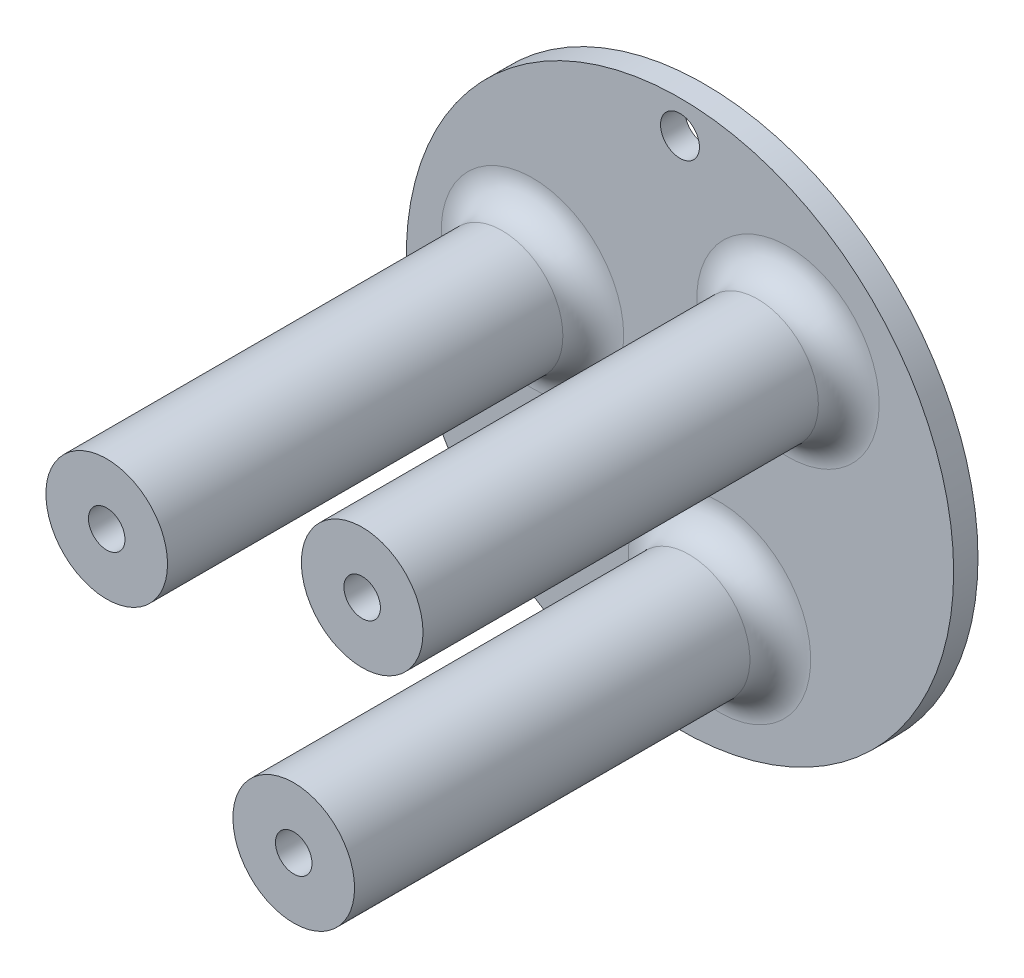
ISO-10303-21;
HEADER;
FILE_DESCRIPTION(('STEP AP214'),'2;1');
FILE_NAME('part.step','',(''),(''),'','','');
FILE_SCHEMA(('AUTOMOTIVE_DESIGN { 1 0 10303 214 1 1 1 1 }'));
ENDSEC;
DATA;
#1=APPLICATION_CONTEXT('core data for automotive mechanical design processes');
#2=APPLICATION_PROTOCOL_DEFINITION('international standard','automotive_design',2000,#1);
#3=PRODUCT_CONTEXT('',#1,'mechanical');
#4=PRODUCT('Part','Part','',(#3));
#5=PRODUCT_RELATED_PRODUCT_CATEGORY('part','',(#4));
#6=PRODUCT_DEFINITION_FORMATION('','',#4);
#7=PRODUCT_DEFINITION_CONTEXT('part definition',#1,'design');
#8=PRODUCT_DEFINITION('design','',#6,#7);
#9=PRODUCT_DEFINITION_SHAPE('','',#8);
#10=(LENGTH_UNIT() NAMED_UNIT(*) SI_UNIT(.MILLI.,.METRE.));
#11=(NAMED_UNIT(*) PLANE_ANGLE_UNIT() SI_UNIT($,.RADIAN.));
#12=(NAMED_UNIT(*) SI_UNIT($,.STERADIAN.) SOLID_ANGLE_UNIT());
#13=UNCERTAINTY_MEASURE_WITH_UNIT(LENGTH_MEASURE(1.E-05),#10,'distance_accuracy_value','');
#14=(GEOMETRIC_REPRESENTATION_CONTEXT(3) GLOBAL_UNCERTAINTY_ASSIGNED_CONTEXT((#13)) GLOBAL_UNIT_ASSIGNED_CONTEXT((#10,
#11,#12)) REPRESENTATION_CONTEXT('',''));
#15=CARTESIAN_POINT('',(0.,0.,0.));
#16=DIRECTION('',(0.,0.,1.));
#17=DIRECTION('',(1.,0.,0.));
#18=AXIS2_PLACEMENT_3D('',#15,#16,#17);
#19=CARTESIAN_POINT('',(0.,0.,2.));
#20=DIRECTION('',(0.,0.,1.));
#21=DIRECTION('',(1.,0.,0.));
#22=AXIS2_PLACEMENT_3D('',#19,#20,#21);
#23=PLANE('',#22);
#24=CARTESIAN_POINT('',(8.87639550230623,8.87639550230733,2.));
#25=DIRECTION('',(0.,0.,1.));
#26=DIRECTION('',(1.,0.,0.));
#27=AXIS2_PLACEMENT_3D('',#24,#25,#26);
#28=CIRCLE('',#27,7.5);
#29=CARTESIAN_POINT('',(16.3763955023062,8.87639550230733,2.));
#30=VERTEX_POINT('',#29);
#31=EDGE_CURVE('E87',#30,#30,#28,.F.);
#32=ORIENTED_EDGE('',*,*,#31,.T.);
#33=EDGE_LOOP('',(#32));
#34=FACE_BOUND('',#33,.T.);
#35=CARTESIAN_POINT('',(-12.1253817501885,3.24898624788211,2.));
#36=DIRECTION('',(0.,0.,1.));
#37=DIRECTION('',(1.,0.,0.));
#38=AXIS2_PLACEMENT_3D('',#35,#36,#37);
#39=CIRCLE('',#38,7.5);
#40=CARTESIAN_POINT('',(-4.62538175018853,3.24898624788211,2.));
#41=VERTEX_POINT('',#40);
#42=EDGE_CURVE('E88',#41,#41,#39,.F.);
#43=ORIENTED_EDGE('',*,*,#42,.T.);
#44=EDGE_LOOP('',(#43));
#45=FACE_BOUND('',#44,.T.);
#46=CARTESIAN_POINT('',(0.,19.8,2.));
#47=DIRECTION('',(0.,0.,1.));
#48=DIRECTION('',(1.,0.,0.));
#49=AXIS2_PLACEMENT_3D('',#46,#47,#48);
#50=CIRCLE('',#49,1.6);
#51=CARTESIAN_POINT('',(1.6,19.8,2.));
#52=VERTEX_POINT('',#51);
#53=EDGE_CURVE('E146',#52,#52,#50,.T.);
#54=ORIENTED_EDGE('',*,*,#53,.F.);
#55=EDGE_LOOP('',(#54));
#56=FACE_BOUND('',#55,.T.);
#57=CARTESIAN_POINT('',(0.,0.,2.));
#58=DIRECTION('',(0.,0.,1.));
#59=DIRECTION('',(1.,0.,0.));
#60=AXIS2_PLACEMENT_3D('',#57,#58,#59);
#61=CIRCLE('',#60,22.5);
#62=CARTESIAN_POINT('',(22.5,0.,2.));
#63=VERTEX_POINT('',#62);
#64=EDGE_CURVE('E149',#63,#63,#61,.T.);
#65=ORIENTED_EDGE('',*,*,#64,.T.);
#66=EDGE_LOOP('',(#65));
#67=FACE_BOUND('',#66,.T.);
#68=CARTESIAN_POINT('',(0.,-19.8,2.));
#69=DIRECTION('',(0.,0.,1.));
#70=DIRECTION('',(1.,0.,0.));
#71=AXIS2_PLACEMENT_3D('',#68,#69,#70);
#72=CIRCLE('',#71,1.6);
#73=CARTESIAN_POINT('',(-0.819635602999164,-18.4258830187003,2.));
#74=VERTEX_POINT('',#73);
#75=CARTESIAN_POINT('',(1.5571198486546,-19.4320628084498,2.));
#76=VERTEX_POINT('',#75);
#77=EDGE_CURVE('E84',#74,#76,#72,.T.);
#78=ORIENTED_EDGE('',*,*,#77,.F.);
#79=CARTESIAN_POINT('',(3.24898624788274,-12.1253817501879,2.));
#80=DIRECTION('',(0.,0.,1.));
#81=DIRECTION('',(1.,0.,0.));
#82=AXIS2_PLACEMENT_3D('',#79,#80,#81);
#83=CIRCLE('',#82,7.5);
#84=EDGE_CURVE('E82',#74,#76,#83,.F.);
#85=ORIENTED_EDGE('',*,*,#84,.T.);
#86=EDGE_LOOP('',(#78,#85));
#87=FACE_BOUND('',#86,.T.);
#88=ADVANCED_FACE('F40',(#34,#45,#56,#67,#87),#23,.T.);
#89=CARTESIAN_POINT('',(0.,0.,0.));
#90=DIRECTION('',(0.,0.,1.));
#91=DIRECTION('',(1.,0.,0.));
#92=AXIS2_PLACEMENT_3D('',#89,#90,#91);
#93=PLANE('',#92);
#94=CARTESIAN_POINT('',(0.,0.,0.));
#95=DIRECTION('',(0.,0.,1.));
#96=DIRECTION('',(1.,0.,0.));
#97=AXIS2_PLACEMENT_3D('',#94,#95,#96);
#98=CIRCLE('',#97,22.5);
#99=CARTESIAN_POINT('',(22.5,0.,0.));
#100=VERTEX_POINT('',#99);
#101=EDGE_CURVE('E151',#100,#100,#98,.T.);
#102=ORIENTED_EDGE('',*,*,#101,.F.);
#103=EDGE_LOOP('',(#102));
#104=FACE_BOUND('',#103,.T.);
#105=CARTESIAN_POINT('',(0.,19.8,0.));
#106=DIRECTION('',(0.,0.,1.));
#107=DIRECTION('',(1.,0.,0.));
#108=AXIS2_PLACEMENT_3D('',#105,#106,#107);
#109=CIRCLE('',#108,1.6);
#110=CARTESIAN_POINT('',(1.6,19.8,0.));
#111=VERTEX_POINT('',#110);
#112=EDGE_CURVE('E97',#111,#111,#109,.T.);
#113=ORIENTED_EDGE('',*,*,#112,.T.);
#114=EDGE_LOOP('',(#113));
#115=FACE_BOUND('',#114,.T.);
#116=CARTESIAN_POINT('',(0.,-19.8,0.));
#117=DIRECTION('',(0.,0.,1.));
#118=DIRECTION('',(1.,0.,0.));
#119=AXIS2_PLACEMENT_3D('',#116,#117,#118);
#120=CIRCLE('',#119,1.6);
#121=CARTESIAN_POINT('',(1.6,-19.8,0.));
#122=VERTEX_POINT('',#121);
#123=EDGE_CURVE('E94',#122,#122,#120,.T.);
#124=ORIENTED_EDGE('',*,*,#123,.T.);
#125=EDGE_LOOP('',(#124));
#126=FACE_BOUND('',#125,.T.);
#127=ADVANCED_FACE('F127',(#104,#115,#126),#93,.F.);
#128=CARTESIAN_POINT('',(0.,0.,2.));
#129=DIRECTION('',(0.,0.,-1.));
#130=DIRECTION('',(-1.,0.,0.));
#131=AXIS2_PLACEMENT_3D('',#128,#129,#130);
#132=CYLINDRICAL_SURFACE('',#131,22.5);
#133=ORIENTED_EDGE('',*,*,#64,.F.);
#134=EDGE_LOOP('',(#133));
#135=FACE_BOUND('',#134,.T.);
#136=ORIENTED_EDGE('',*,*,#101,.T.);
#137=EDGE_LOOP('',(#136));
#138=FACE_BOUND('',#137,.T.);
#139=ADVANCED_FACE('F122',(#135,#138),#132,.T.);
#140=CARTESIAN_POINT('',(0.,19.8,2.));
#141=DIRECTION('',(0.,0.,-1.));
#142=DIRECTION('',(-1.,0.,0.));
#143=AXIS2_PLACEMENT_3D('',#140,#141,#142);
#144=CYLINDRICAL_SURFACE('',#143,1.6);
#145=ORIENTED_EDGE('',*,*,#53,.T.);
#146=EDGE_LOOP('',(#145));
#147=FACE_BOUND('',#146,.T.);
#148=ORIENTED_EDGE('',*,*,#112,.F.);
#149=EDGE_LOOP('',(#148));
#150=FACE_BOUND('',#149,.T.);
#151=ADVANCED_FACE('F118',(#147,#150),#144,.F.);
#152=CARTESIAN_POINT('',(0.,-19.8,2.));
#153=DIRECTION('',(0.,0.,-1.));
#154=DIRECTION('',(-1.,0.,0.));
#155=AXIS2_PLACEMENT_3D('',#152,#153,#154);
#156=CYLINDRICAL_SURFACE('',#155,1.6);
#157=EDGE_CURVE('E93',#76,#74,#72,.T.);
#158=ORIENTED_EDGE('',*,*,#157,.T.);
#159=ORIENTED_EDGE('',*,*,#77,.T.);
#160=EDGE_LOOP('',(#158,#159));
#161=FACE_BOUND('',#160,.T.);
#162=ORIENTED_EDGE('',*,*,#123,.F.);
#163=EDGE_LOOP('',(#162));
#164=FACE_BOUND('',#163,.T.);
#165=ADVANCED_FACE('F91',(#161,#164),#156,.F.);
#166=CARTESIAN_POINT('',(-12.1253817501885,3.24898624788211,37.));
#167=DIRECTION('',(0.,0.,1.));
#168=DIRECTION('',(1.,0.,0.));
#169=AXIS2_PLACEMENT_3D('',#166,#167,#168);
#170=PLANE('',#169);
#171=CARTESIAN_POINT('',(-12.1253817501885,3.24898624788211,37.));
#172=DIRECTION('',(0.,0.,1.));
#173=DIRECTION('',(1.,0.,0.));
#174=AXIS2_PLACEMENT_3D('',#171,#172,#173);
#175=CIRCLE('',#174,5.);
#176=CARTESIAN_POINT('',(-7.12538175018853,3.24898624788211,37.));
#177=VERTEX_POINT('',#176);
#178=EDGE_CURVE('E216',#177,#177,#175,.T.);
#179=ORIENTED_EDGE('',*,*,#178,.T.);
#180=EDGE_LOOP('',(#179));
#181=FACE_BOUND('',#180,.T.);
#182=CARTESIAN_POINT('',(-12.1253817501885,3.24898624788211,37.));
#183=DIRECTION('',(0.,0.,1.));
#184=DIRECTION('',(1.,0.,0.));
#185=AXIS2_PLACEMENT_3D('',#182,#183,#184);
#186=CIRCLE('',#185,1.5);
#187=CARTESIAN_POINT('',(-10.6253817501885,3.24898624788211,37.));
#188=VERTEX_POINT('',#187);
#189=EDGE_CURVE('E219',#188,#188,#186,.T.);
#190=ORIENTED_EDGE('',*,*,#189,.F.);
#191=EDGE_LOOP('',(#190));
#192=FACE_BOUND('',#191,.T.);
#193=ADVANCED_FACE('F117',(#181,#192),#170,.T.);
#194=CARTESIAN_POINT('',(-12.1253817501885,3.24898624788211,37.));
#195=DIRECTION('',(0.,0.,-1.));
#196=DIRECTION('',(-1.,0.,0.));
#197=AXIS2_PLACEMENT_3D('',#194,#195,#196);
#198=CYLINDRICAL_SURFACE('',#197,5.);
#199=CARTESIAN_POINT('',(-12.1253817501885,3.24898624788211,4.5));
#200=DIRECTION('',(0.,0.,1.));
#201=DIRECTION('',(1.,0.,0.));
#202=AXIS2_PLACEMENT_3D('',#199,#200,#201);
#203=CIRCLE('',#202,5.);
#204=CARTESIAN_POINT('',(-7.12538175018853,3.24898624788211,4.5));
#205=VERTEX_POINT('',#204);
#206=EDGE_CURVE('E11',#205,#205,#203,.T.);
#207=ORIENTED_EDGE('',*,*,#206,.T.);
#208=EDGE_LOOP('',(#207));
#209=FACE_BOUND('',#208,.T.);
#210=ORIENTED_EDGE('',*,*,#178,.F.);
#211=EDGE_LOOP('',(#210));
#212=FACE_BOUND('',#211,.T.);
#213=ADVANCED_FACE('F119',(#209,#212),#198,.T.);
#214=CARTESIAN_POINT('',(-12.1253817501885,3.24898624788211,37.));
#215=DIRECTION('',(0.,0.,-1.));
#216=DIRECTION('',(-1.,0.,0.));
#217=AXIS2_PLACEMENT_3D('',#214,#215,#216);
#218=CYLINDRICAL_SURFACE('',#217,1.5);
#219=CARTESIAN_POINT('',(-12.1253817501885,3.24898624788211,17.));
#220=DIRECTION('',(0.,0.,1.));
#221=DIRECTION('',(1.,0.,0.));
#222=AXIS2_PLACEMENT_3D('',#219,#220,#221);
#223=CIRCLE('',#222,1.5);
#224=CARTESIAN_POINT('',(-10.6253817501885,3.24898624788211,17.));
#225=VERTEX_POINT('',#224);
#226=EDGE_CURVE('E150',#225,#225,#223,.T.);
#227=ORIENTED_EDGE('',*,*,#226,.F.);
#228=EDGE_LOOP('',(#227));
#229=FACE_BOUND('',#228,.T.);
#230=ORIENTED_EDGE('',*,*,#189,.T.);
#231=EDGE_LOOP('',(#230));
#232=FACE_BOUND('',#231,.T.);
#233=ADVANCED_FACE('F200',(#229,#232),#218,.F.);
#234=CARTESIAN_POINT('',(8.87639550230623,8.87639550230733,37.));
#235=DIRECTION('',(0.,0.,1.));
#236=DIRECTION('',(1.,0.,0.));
#237=AXIS2_PLACEMENT_3D('',#234,#235,#236);
#238=PLANE('',#237);
#239=CARTESIAN_POINT('',(8.87639550230623,8.87639550230733,37.));
#240=DIRECTION('',(0.,0.,1.));
#241=DIRECTION('',(1.,0.,0.));
#242=AXIS2_PLACEMENT_3D('',#239,#240,#241);
#243=CIRCLE('',#242,5.);
#244=CARTESIAN_POINT('',(13.8763955023062,8.87639550230733,37.));
#245=VERTEX_POINT('',#244);
#246=EDGE_CURVE('E225',#245,#245,#243,.T.);
#247=ORIENTED_EDGE('',*,*,#246,.T.);
#248=EDGE_LOOP('',(#247));
#249=FACE_BOUND('',#248,.T.);
#250=CARTESIAN_POINT('',(8.87639550230646,8.87639550230643,37.));
#251=DIRECTION('',(0.,0.,1.));
#252=DIRECTION('',(1.,0.,0.));
#253=AXIS2_PLACEMENT_3D('',#250,#251,#252);
#254=CIRCLE('',#253,1.5);
#255=CARTESIAN_POINT('',(10.3763955023065,8.87639550230643,37.));
#256=VERTEX_POINT('',#255);
#257=EDGE_CURVE('E221',#256,#256,#254,.T.);
#258=ORIENTED_EDGE('',*,*,#257,.F.);
#259=EDGE_LOOP('',(#258));
#260=FACE_BOUND('',#259,.T.);
#261=ADVANCED_FACE('F196',(#249,#260),#238,.T.);
#262=CARTESIAN_POINT('',(8.87639550230623,8.87639550230733,37.));
#263=DIRECTION('',(0.,0.,-1.));
#264=DIRECTION('',(-1.,0.,0.));
#265=AXIS2_PLACEMENT_3D('',#262,#263,#264);
#266=CYLINDRICAL_SURFACE('',#265,5.);
#267=CARTESIAN_POINT('',(8.87639550230623,8.87639550230733,4.5));
#268=DIRECTION('',(0.,0.,1.));
#269=DIRECTION('',(1.,0.,0.));
#270=AXIS2_PLACEMENT_3D('',#267,#268,#269);
#271=CIRCLE('',#270,5.);
#272=CARTESIAN_POINT('',(13.8763955023062,8.87639550230733,4.5));
#273=VERTEX_POINT('',#272);
#274=EDGE_CURVE('E166',#273,#273,#271,.T.);
#275=ORIENTED_EDGE('',*,*,#274,.T.);
#276=EDGE_LOOP('',(#275));
#277=FACE_BOUND('',#276,.T.);
#278=ORIENTED_EDGE('',*,*,#246,.F.);
#279=EDGE_LOOP('',(#278));
#280=FACE_BOUND('',#279,.T.);
#281=ADVANCED_FACE('F193',(#277,#280),#266,.T.);
#282=CARTESIAN_POINT('',(8.87639550230646,8.87639550230643,37.));
#283=DIRECTION('',(0.,0.,-1.));
#284=DIRECTION('',(-1.,0.,0.));
#285=AXIS2_PLACEMENT_3D('',#282,#283,#284);
#286=CYLINDRICAL_SURFACE('',#285,1.5);
#287=CARTESIAN_POINT('',(8.87639550230646,8.87639550230643,17.));
#288=DIRECTION('',(0.,0.,1.));
#289=DIRECTION('',(1.,0.,0.));
#290=AXIS2_PLACEMENT_3D('',#287,#288,#289);
#291=CIRCLE('',#290,1.5);
#292=CARTESIAN_POINT('',(10.3763955023065,8.87639550230643,17.));
#293=VERTEX_POINT('',#292);
#294=EDGE_CURVE('E154',#293,#293,#291,.T.);
#295=ORIENTED_EDGE('',*,*,#294,.F.);
#296=EDGE_LOOP('',(#295));
#297=FACE_BOUND('',#296,.T.);
#298=ORIENTED_EDGE('',*,*,#257,.T.);
#299=EDGE_LOOP('',(#298));
#300=FACE_BOUND('',#299,.T.);
#301=ADVANCED_FACE('F188',(#297,#300),#286,.F.);
#302=CARTESIAN_POINT('',(3.24898624788274,-12.1253817501879,37.));
#303=DIRECTION('',(0.,0.,1.));
#304=DIRECTION('',(1.,0.,0.));
#305=AXIS2_PLACEMENT_3D('',#302,#303,#304);
#306=PLANE('',#305);
#307=CARTESIAN_POINT('',(3.24898624788274,-12.1253817501879,37.));
#308=DIRECTION('',(0.,0.,1.));
#309=DIRECTION('',(1.,0.,0.));
#310=AXIS2_PLACEMENT_3D('',#307,#308,#309);
#311=CIRCLE('',#310,5.);
#312=CARTESIAN_POINT('',(8.24898624788274,-12.1253817501879,37.));
#313=VERTEX_POINT('',#312);
#314=EDGE_CURVE('E100',#313,#313,#311,.T.);
#315=ORIENTED_EDGE('',*,*,#314,.T.);
#316=EDGE_LOOP('',(#315));
#317=FACE_BOUND('',#316,.T.);
#318=CARTESIAN_POINT('',(3.24898624788208,-12.1253817501885,37.));
#319=DIRECTION('',(0.,0.,1.));
#320=DIRECTION('',(1.,0.,0.));
#321=AXIS2_PLACEMENT_3D('',#318,#319,#320);
#322=CIRCLE('',#321,1.5);
#323=CARTESIAN_POINT('',(4.74898624788208,-12.1253817501885,37.));
#324=VERTEX_POINT('',#323);
#325=EDGE_CURVE('E237',#324,#324,#322,.T.);
#326=ORIENTED_EDGE('',*,*,#325,.F.);
#327=EDGE_LOOP('',(#326));
#328=FACE_BOUND('',#327,.T.);
#329=ADVANCED_FACE('F182',(#317,#328),#306,.T.);
#330=CARTESIAN_POINT('',(3.24898624788274,-12.1253817501879,37.));
#331=DIRECTION('',(0.,0.,-1.));
#332=DIRECTION('',(-1.,0.,0.));
#333=AXIS2_PLACEMENT_3D('',#330,#331,#332);
#334=CYLINDRICAL_SURFACE('',#333,5.);
#335=CARTESIAN_POINT('',(3.24898624788274,-12.1253817501879,4.5));
#336=DIRECTION('',(0.,0.,1.));
#337=DIRECTION('',(1.,0.,0.));
#338=AXIS2_PLACEMENT_3D('',#335,#336,#337);
#339=CIRCLE('',#338,5.);
#340=CARTESIAN_POINT('',(2.12107531506398,-16.9965024556958,4.5));
#341=VERTEX_POINT('',#340);
#342=CARTESIAN_POINT('',(0.536571680628133,-16.3257159291962,4.5));
#343=VERTEX_POINT('',#342);
#344=EDGE_CURVE('E65',#341,#343,#339,.T.);
#345=ORIENTED_EDGE('',*,*,#344,.T.);
#346=CARTESIAN_POINT('',(0.294410797133569,-16.1590505399909,4.46628111594363));
#347=CARTESIAN_POINT('',(0.625372035199988,-16.4014725136573,1.87075022355507));
#348=CARTESIAN_POINT('',(-0.941961150610801,-18.5066674090784,2.));
#349=CARTESIAN_POINT('',(0.315356500499125,-16.1743935572757,4.4724398897492));
#350=CARTESIAN_POINT('',(0.615458480193219,-16.3915657183082,1.87801889354864));
#351=CARTESIAN_POINT('',(-0.934323558492292,-18.5011142264454,2.));
#352=CARTESIAN_POINT('',(0.336495436539265,-16.1896259683654,4.47772145775334));
#353=CARTESIAN_POINT('',(0.605726581884699,-16.3823137458833,1.88641094843269));
#354=CARTESIAN_POINT('',(-0.92602281297485,-18.4951631488922,2.));
#355=CARTESIAN_POINT('',(0.379146027682397,-16.2198535975708,4.48658841081184));
#356=CARTESIAN_POINT('',(0.587181824639358,-16.3654265100251,1.90549747707554));
#357=CARTESIAN_POINT('',(-0.907761191183319,-18.4823883300672,2.));
#358=CARTESIAN_POINT('',(0.400658183758189,-16.234848435227,4.49017129792471));
#359=CARTESIAN_POINT('',(0.578374886279501,-16.3577948517131,1.91617841656128));
#360=CARTESIAN_POINT('',(-0.89779789901017,-18.4755633222672,2.));
#361=CARTESIAN_POINT('',(0.443912394536721,-16.2644935344249,4.49567278809467));
#362=CARTESIAN_POINT('',(0.562263204112896,-16.3444708537823,1.93981522071669));
#363=CARTESIAN_POINT('',(-0.875931939887049,-18.4610023414975,2.));
#364=CARTESIAN_POINT('',(0.465653525629068,-16.2791447229522,4.49759653493978));
#365=CARTESIAN_POINT('',(0.55495469131483,-16.3387700345339,1.95274215693768));
#366=CARTESIAN_POINT('',(-0.864035403828488,-18.4532692691043,2.));
#367=CARTESIAN_POINT('',(0.509361273294691,-16.3081011458751,4.49987554623895));
#368=CARTESIAN_POINT('',(0.542442560516338,-16.3295573310685,1.98080942381337));
#369=CARTESIAN_POINT('',(-0.837878518119624,-18.4368434624638,2.));
#370=CARTESIAN_POINT('',(0.531327584563999,-16.3224067781335,4.50023270931222));
#371=CARTESIAN_POINT('',(0.537231016398835,-16.3260353195471,1.99592096783945));
#372=CARTESIAN_POINT('',(-0.823621051566726,-18.4281519029643,2.));
#373=CARTESIAN_POINT('',(0.591718770269872,-16.3610632725792,4.49920260803043));
#374=CARTESIAN_POINT('',(0.526768246612817,-16.319746622721,2.04002803882277));
#375=CARTESIAN_POINT('',(-0.780695491202649,-18.4030280295183,2.));
#376=CARTESIAN_POINT('',(0.630361474474926,-16.3850604719764,4.49633845619348));
#377=CARTESIAN_POINT('',(0.524206845266073,-16.3193596791769,2.07111638571168));
#378=CARTESIAN_POINT('',(-0.749142984209174,-18.3856056242948,2.));
#379=CARTESIAN_POINT('',(0.708136775240847,-16.4319055420797,4.48691501913684));
#380=CARTESIAN_POINT('',(0.531389583153325,-16.3271880938516,2.13833753756292));
#381=CARTESIAN_POINT('',(-0.673930110321679,-18.348236148108,2.));
#382=CARTESIAN_POINT('',(0.747269490298202,-16.4547531278059,4.48035482256581));
#383=CARTESIAN_POINT('',(0.540953730444524,-16.3352732571851,2.17429650273422));
#384=CARTESIAN_POINT('',(-0.630266758547662,-18.3282884554135,2.));
#385=CARTESIAN_POINT('',(0.806342752145068,-16.4881797961654,4.46858099267805));
#386=CARTESIAN_POINT('',(0.567929495449871,-16.3546284625683,2.23038259662899));
#387=CARTESIAN_POINT('',(-0.552038877723575,-18.2979969360935,2.));
#388=CARTESIAN_POINT('',(0.826126347418437,-16.4991972209806,4.46432623725199));
#389=CARTESIAN_POINT('',(0.578935940938915,-16.3622255695978,2.24932231554136));
#390=CARTESIAN_POINT('',(-0.52378847025059,-18.2878224625599,2.));
#391=CARTESIAN_POINT('',(0.865806611360362,-16.5209439066228,4.45536780985839));
#392=CARTESIAN_POINT('',(0.605630787676838,-16.3798412501385,2.28733308093567));
#393=CARTESIAN_POINT('',(-0.462347066857394,-18.2679146213166,2.));
#394=CARTESIAN_POINT('',(0.885703280266326,-16.5316731668445,4.45066413694799));
#395=CARTESIAN_POINT('',(0.621270885638951,-16.3898338374465,2.30639295002553));
#396=CARTESIAN_POINT('',(-0.429156060560259,-18.2581812545334,2.));
#397=CARTESIAN_POINT('',(0.925633145203206,-16.5528574996303,4.44103283542737));
#398=CARTESIAN_POINT('',(0.657703908260609,-16.4122453772484,2.34409197272381));
#399=CARTESIAN_POINT('',(-0.357157989296166,-18.239930576371,2.));
#400=CARTESIAN_POINT('',(0.945666416265912,-16.5633124031097,4.4361050735975));
#401=CARTESIAN_POINT('',(0.678447714624428,-16.424640444683,2.36272928466187));
#402=CARTESIAN_POINT('',(-0.318347552860372,-18.2314140011637,2.));
#403=CARTESIAN_POINT('',(0.985877797727405,-16.5839522492602,4.42630249631303));
#404=CARTESIAN_POINT('',(0.725419696343384,-16.4517625112535,2.39887388807557));
#405=CARTESIAN_POINT('',(-0.234619825538966,-18.2167251074887,2.));
#406=CARTESIAN_POINT('',(1.00605591021775,-16.5941371880229,4.42142768162557));
#407=CARTESIAN_POINT('',(0.751599290715318,-16.466469048421,2.41639243572873));
#408=CARTESIAN_POINT('',(-0.189702446298336,-18.2105528229431,2.));
#409=CARTESIAN_POINT('',(1.04688281544615,-16.6143980719391,4.4119779213323));
#410=CARTESIAN_POINT('',(0.809973232634462,-16.4982276986997,2.44972172404406));
#411=CARTESIAN_POINT('',(-0.0929158328081849,-18.2019517161426,2.));
#412=CARTESIAN_POINT('',(1.06753413464158,-16.6244701101765,4.40740854949047));
#413=CARTESIAN_POINT('',(0.842221666395691,-16.5153036291314,2.46553222823402));
#414=CARTESIAN_POINT('',(-0.0409526925218015,-18.199580248641,2.));
#415=CARTESIAN_POINT('',(1.10902983092342,-16.6443546183743,4.39901474090622));
#416=CARTESIAN_POINT('',(0.91217802473345,-16.5512127451775,2.49418157738696));
#417=CARTESIAN_POINT('',(0.0688040044465989,-18.2005409560565,2.));
#418=CARTESIAN_POINT('',(1.12987420573519,-16.6541670913877,4.39519029539849));
#419=CARTESIAN_POINT('',(0.949886002200391,-16.5700541474853,2.50706124900176));
#420=CARTESIAN_POINT('',(0.126597492512617,-18.203873063857,2.));
#421=CARTESIAN_POINT('',(1.17173053668261,-16.6735175654276,4.38865209885406));
#422=CARTESIAN_POINT('',(1.02983997898093,-16.6088165870847,2.52887289696206));
#423=CARTESIAN_POINT('',(0.246278297431131,-18.2179256065643,2.));
#424=CARTESIAN_POINT('',(1.19274218897313,-16.683055962,4.38593666381824));
#425=CARTESIAN_POINT('',(1.07212860767493,-16.6287668820483,2.53785626190962));
#426=CARTESIAN_POINT('',(0.308159240346595,-18.2286347726875,2.));
#427=CARTESIAN_POINT('',(1.23494569945864,-16.7018623003295,4.38190318481052));
#428=CARTESIAN_POINT('',(1.15978543809201,-16.6689102132978,2.55112213964111));
#429=CARTESIAN_POINT('',(0.433318880333783,-18.2584549815049,2.));
#430=CARTESIAN_POINT('',(1.25613754334664,-16.7111302633045,4.38058503092148));
#431=CARTESIAN_POINT('',(1.2052561859569,-16.6891547907458,2.55544043568405));
#432=CARTESIAN_POINT('',(0.496597467060009,-18.2775653631499,2.));
#433=CARTESIAN_POINT('',(1.29862763263736,-16.7293620706576,4.37950379464862));
#434=CARTESIAN_POINT('',(1.29717687711421,-16.7288822855203,2.55897394839699));
#435=CARTESIAN_POINT('',(0.620980880871832,-18.3239319003565,2.));
#436=CARTESIAN_POINT('',(1.31992563885853,-16.738326400742,4.37973809809649));
#437=CARTESIAN_POINT('',(1.34376078011258,-16.748426319842,2.55820828738378));
#438=CARTESIAN_POINT('',(0.682089188065165,-18.3511742886563,2.));
#439=CARTESIAN_POINT('',(1.36261690384172,-16.7559480274826,4.38172711864942));
#440=CARTESIAN_POINT('',(1.43580109592152,-16.7858941314396,2.55170086289177));
#441=CARTESIAN_POINT('',(0.798996860013705,-18.412210806416,2.));
#442=CARTESIAN_POINT('',(1.38401016746864,-16.7646053082501,4.38348191431461));
#443=CARTESIAN_POINT('',(1.4813896918936,-16.8038694350112,2.54593981489922));
#444=CARTESIAN_POINT('',(0.854795950289275,-18.446005274336,2.));
#445=CARTESIAN_POINT('',(1.42688390364894,-16.7816115265141,4.38831097658367));
#446=CARTESIAN_POINT('',(1.56957267373672,-16.8375684957227,2.53000375985303));
#447=CARTESIAN_POINT('',(0.958975982762175,-18.51766556951,2.));
#448=CARTESIAN_POINT('',(1.44836445471933,-16.7899600344983,4.39138701124929));
#449=CARTESIAN_POINT('',(1.61225702997701,-16.8533200056688,2.51978282854854));
#450=CARTESIAN_POINT('',(1.00734686648008,-18.5555368011556,2.));
#451=CARTESIAN_POINT('',(1.4913727500844,-16.806335104803,4.39853830590526));
#452=CARTESIAN_POINT('',(1.69319356698955,-16.8822110324945,2.49578616050901));
#453=CARTESIAN_POINT('',(1.09580876646633,-18.6326720834772,2.));
#454=CARTESIAN_POINT('',(1.51290049612632,-16.8143616549843,4.40261360353101));
#455=CARTESIAN_POINT('',(1.73148676838897,-16.8953581405716,2.48196492513099));
#456=CARTESIAN_POINT('',(1.13589947077202,-18.6719361865654,2.));
#457=CARTESIAN_POINT('',(1.56553724699114,-16.8335761624464,4.41333683079861));
#458=CARTESIAN_POINT('',(1.81873026991047,-16.9242475962976,2.44498664126905));
#459=CARTESIAN_POINT('',(1.22409324488605,-18.7668141173795,2.));
#460=CARTESIAN_POINT('',(1.59667665442283,-16.8445938759919,4.42032583168743));
#461=CARTESIAN_POINT('',(1.86466443370814,-16.9384674460148,2.42040497520571));
#462=CARTESIAN_POINT('',(1.26790907866098,-18.8219861265194,2.));
#463=CARTESIAN_POINT('',(1.65912353819072,-16.8659961955783,4.43456917999635));
#464=CARTESIAN_POINT('',(1.94492429224262,-16.9618957363156,2.36854199174319));
#465=CARTESIAN_POINT('',(1.34218317397486,-18.9266850494444,2.));
#466=CARTESIAN_POINT('',(1.69043091142479,-16.8763811503114,4.44182337768348));
#467=CARTESIAN_POINT('',(1.97911355152233,-16.9710433570881,2.34121687474385));
#468=CARTESIAN_POINT('',(1.37264885071617,-18.9762150856595,2.));
#469=CARTESIAN_POINT('',(1.75330283751796,-16.8965473180414,4.4557451991664));
#470=CARTESIAN_POINT('',(2.03653765992672,-16.9853000810163,2.28592403341707));
#471=CARTESIAN_POINT('',(1.42390875538763,-19.0683860733191,2.));
#472=CARTESIAN_POINT('',(1.78486741425546,-16.9063284742427,4.4624127678066));
#473=CARTESIAN_POINT('',(2.05960014267718,-16.9903483994141,2.25796962340404));
#474=CARTESIAN_POINT('',(1.44470207469683,-19.1110263772969,2.));
#475=CARTESIAN_POINT('',(1.84828934619691,-16.9252925453047,4.47450293194339));
#476=CARTESIAN_POINT('',(2.09587442674456,-16.997429626321,2.20295935760976));
#477=CARTESIAN_POINT('',(1.47957397573466,-19.1895085098914,2.));
#478=CARTESIAN_POINT('',(1.88014674343214,-16.9344753727018,4.47992534571446));
#479=CARTESIAN_POINT('',(2.10893434217058,-16.9994188493737,2.17595345333964));
#480=CARTESIAN_POINT('',(1.49365157765293,-19.2253493460195,2.));
#481=CARTESIAN_POINT('',(1.94447614231344,-16.9523247597567,4.48907548281257));
#482=CARTESIAN_POINT('',(2.12660850231096,-17.0013671039115,2.12368546021604));
#483=CARTESIAN_POINT('',(1.51737316953397,-19.2912624434067,2.));
#484=CARTESIAN_POINT('',(1.97695109129028,-16.9609849740857,4.49278503850503));
#485=CARTESIAN_POINT('',(2.13101812505051,-17.0012792846263,2.09851501013122));
#486=CARTESIAN_POINT('',(1.52696964139971,-19.3212709921888,2.));
#487=CARTESIAN_POINT('',(2.04213841926708,-16.97766473256,4.49804644138823));
#488=CARTESIAN_POINT('',(2.13252987856754,-16.9999124870327,2.05103234507692));
#489=CARTESIAN_POINT('',(1.54304072487598,-19.3759353695203,2.));
#490=CARTESIAN_POINT('',(2.07485075034211,-16.9856844023034,4.49959871256339));
#491=CARTESIAN_POINT('',(2.12955956162871,-16.9986231058956,2.02878935044679));
#492=CARTESIAN_POINT('',(1.54951594976096,-19.4005922490621,2.));
#493=CARTESIAN_POINT('',(2.14076270636084,-17.001137710206,4.50026768061131));
#494=CARTESIAN_POINT('',(2.11766181863412,-16.9956077049849,1.98747593128248));
#495=CARTESIAN_POINT('',(1.56044350374274,-19.4456489278055,2.));
#496=CARTESIAN_POINT('',(2.17396398117285,-17.0085649144352,4.49936062347435));
#497=CARTESIAN_POINT('',(2.10863751335386,-16.9938767228784,1.96850464687041));
#498=CARTESIAN_POINT('',(1.56487561640898,-19.4660051462294,2.));
#499=CARTESIAN_POINT('',(2.24045843674496,-17.0227312442342,4.49486608060282));
#500=CARTESIAN_POINT('',(2.08590060043959,-16.9905826313381,1.93423971030196));
#501=CARTESIAN_POINT('',(1.57228151986429,-19.5029282568234,2.));
#502=CARTESIAN_POINT('',(2.27375166883469,-17.02946983132,4.49127651516214));
#503=CARTESIAN_POINT('',(2.07217119184088,-16.9890235046081,1.91900211649884));
#504=CARTESIAN_POINT('',(1.57525417619558,-19.5194921958766,2.));
#505=CARTESIAN_POINT('',(2.30702459617397,-17.0358509993239,4.48624911512807));
#506=CARTESIAN_POINT('',(2.05686995221909,-16.9878645300789,1.90574514433382));
#507=CARTESIAN_POINT('',(1.57782328335969,-19.5345311948871,2.));
#508=(BOUNDED_SURFACE() B_SPLINE_SURFACE(3,2,((#346,#347,#348),(#349,#350,#351),(#352,#353,
#354),(#355,#356,#357),(#358,#359,#360),(#361,#362,#363),(#364,#365,#366),(#367,#368,#369),
(#370,#371,#372),(#373,#374,#375),(#376,#377,#378),(#379,#380,#381),(#382,#383,#384),(#385,#386,
#387),(#388,#389,#390),(#391,#392,#393),(#394,#395,#396),(#397,#398,#399),(#400,#401,#402),
(#403,#404,#405),(#406,#407,#408),(#409,#410,#411),(#412,#413,#414),(#415,#416,#417),(#418,#419,
#420),(#421,#422,#423),(#424,#425,#426),(#427,#428,#429),(#430,#431,#432),(#433,#434,#435),
(#436,#437,#438),(#439,#440,#441),(#442,#443,#444),(#445,#446,#447),(#448,#449,#450),(#451,#452,
#453),(#454,#455,#456),(#457,#458,#459),(#460,#461,#462),(#463,#464,#465),(#466,#467,#468),
(#469,#470,#471),(#472,#473,#474),(#475,#476,#477),(#478,#479,#480),(#481,#482,#483),(#484,#485,
#486),(#487,#488,#489),(#490,#491,#492),(#493,#494,#495),(#496,#497,#498),(#499,#500,#501),
(#502,#503,#504),(#505,#506,#507)),.UNSPECIFIED.,.F.,.F.,.F.) B_SPLINE_SURFACE_WITH_KNOTS((4,2,
2,2,2,2,2,2,2,2,2,2,2,2,2,2,2,2,2,2,2,2,2,2,2,2,4),(3,3),(0.,0.118274587207584,
0.236722564017574,0.354801985931844,0.472738262028958,0.677450445044766,0.88221312702254,
0.98490492111128,1.08759693089044,1.19035080969618,1.29310617529941,1.39739800753169,
1.50168861252095,1.60582026123356,1.70994371782061,1.81389188650912,1.91784542626668,
2.02193851058264,2.12603551597708,2.27612981262957,2.42614063500533,2.57616554654849,
2.72621233975072,2.87781599705985,3.02938985455288,3.18243292639199,3.33559477334859),(0.,1.),
.UNSPECIFIED.) GEOMETRIC_REPRESENTATION_ITEM() RATIONAL_B_SPLINE_SURFACE(((1.,0.689276052099482,
1.),(1.,0.690286250313546,1.),(1.,0.691436510904546,1.),(1.,0.694042125810899,1.),(1.,
0.69549792491916,1.),(1.,0.698731721099084,1.),(1.,0.700508701546333,1.),(1.,0.704406415969002,
1.),(1.,0.706526730605944,1.),(1.,0.712825735834791,1.),(1.,0.717371052083672,1.),(1.,
0.727606356815592,1.),(1.,0.733296627392921,1.),(1.,0.742595768949782,1.),(1.,0.74582823063121,
1.),(1.,0.752492440629274,1.),(1.,0.755924189364472,1.),(1.,0.762903995445083,1.),(1.,
0.76645212161751,1.),(1.,0.773527392469267,1.),(1.,0.777054536844263,1.),(1.,0.783944435905288,
1.),(1.,0.787303943920519,1.),(1.,0.793535218855781,1.),(1.,0.796406991514788,1.),(1.,
0.801357885676581,1.),(1.,0.803438208640566,1.),(1.,0.806542310902372,1.),(1.,0.807566173306509,
1.),(1.,0.808405314531088,1.),(1.,0.808222625054582,1.),(1.,0.806681294435466,1.),(1.,
0.805322592531163,1.),(1.,0.801621690251309,1.),(1.,0.799278172101041,1.),(1.,0.793893537114252,
1.),(1.,0.790852394003236,1.),(1.,0.782939000372013,1.),(1.,0.777851418434797,1.),(1.,
0.767554116152621,1.),(1.,0.762344465307972,1.),(1.,0.752222106352125,1.),(1.,0.747309426176041,
1.),(1.,0.737994049301531,1.),(1.,0.73359142709049,1.),(1.,0.725338770199889,1.),(1.,
0.721494943068996,1.),(1.,0.714429685571333,1.),(1.,0.711208133012302,1.),(1.,0.705335715143282,
1.),(1.,0.702690684220715,1.),(1.,0.697966753572782,1.),(1.,0.695888294809022,1.),(1.,
0.694072851024007,1.))) REPRESENTATION_ITEM('') SURFACE());
#509=CARTESIAN_POINT('',(0.294410797133569,-16.1590505399909,4.46628111594363));
#510=CARTESIAN_POINT('',(0.315356500499125,-16.1743935572757,4.4724398897492));
#511=CARTESIAN_POINT('',(0.336495436539265,-16.1896259683654,4.47772145775334));
#512=CARTESIAN_POINT('',(0.379146027682397,-16.2198535975708,4.48658841081184));
#513=CARTESIAN_POINT('',(0.400658183758189,-16.234848435227,4.49017129792471));
#514=CARTESIAN_POINT('',(0.443912394536721,-16.2644935344249,4.49567278809467));
#515=CARTESIAN_POINT('',(0.465653525629068,-16.2791447229522,4.49759653493978));
#516=CARTESIAN_POINT('',(0.509361273294691,-16.3081011458751,4.49987554623895));
#517=CARTESIAN_POINT('',(0.531327584563999,-16.3224067781335,4.50023270931222));
#518=CARTESIAN_POINT('',(0.591718770269872,-16.3610632725792,4.49920260803043));
#519=CARTESIAN_POINT('',(0.630361474474926,-16.3850604719764,4.49633845619348));
#520=CARTESIAN_POINT('',(0.708136775240847,-16.4319055420797,4.48691501913684));
#521=CARTESIAN_POINT('',(0.747269490298202,-16.4547531278059,4.48035482256581));
#522=CARTESIAN_POINT('',(0.806342752145068,-16.4881797961654,4.46858099267805));
#523=CARTESIAN_POINT('',(0.826126347418437,-16.4991972209806,4.46432623725199));
#524=CARTESIAN_POINT('',(0.865806611360362,-16.5209439066228,4.45536780985839));
#525=CARTESIAN_POINT('',(0.885703280266326,-16.5316731668445,4.45066413694799));
#526=CARTESIAN_POINT('',(0.925633145203206,-16.5528574996303,4.44103283542737));
#527=CARTESIAN_POINT('',(0.945666416265912,-16.5633124031097,4.4361050735975));
#528=CARTESIAN_POINT('',(0.985877797727405,-16.5839522492602,4.42630249631303));
#529=CARTESIAN_POINT('',(1.00605591021775,-16.5941371880229,4.42142768162557));
#530=CARTESIAN_POINT('',(1.04688281544615,-16.6143980719391,4.4119779213323));
#531=CARTESIAN_POINT('',(1.06753413464158,-16.6244701101765,4.40740854949047));
#532=CARTESIAN_POINT('',(1.10902983092342,-16.6443546183743,4.39901474090622));
#533=CARTESIAN_POINT('',(1.12987420573519,-16.6541670913877,4.39519029539849));
#534=CARTESIAN_POINT('',(1.17173053668261,-16.6735175654276,4.38865209885406));
#535=CARTESIAN_POINT('',(1.19274218897313,-16.683055962,4.38593666381824));
#536=CARTESIAN_POINT('',(1.23494569945864,-16.7018623003295,4.38190318481052));
#537=CARTESIAN_POINT('',(1.25613754334664,-16.7111302633045,4.38058503092148));
#538=CARTESIAN_POINT('',(1.29862763263736,-16.7293620706576,4.37950379464862));
#539=CARTESIAN_POINT('',(1.31992563885853,-16.738326400742,4.37973809809649));
#540=CARTESIAN_POINT('',(1.36261690384172,-16.7559480274826,4.38172711864942));
#541=CARTESIAN_POINT('',(1.38401016746864,-16.7646053082501,4.38348191431461));
#542=CARTESIAN_POINT('',(1.42688390364894,-16.7816115265141,4.38831097658367));
#543=CARTESIAN_POINT('',(1.44836445471933,-16.7899600344983,4.39138701124929));
#544=CARTESIAN_POINT('',(1.4913727500844,-16.806335104803,4.39853830590526));
#545=CARTESIAN_POINT('',(1.51290049612632,-16.8143616549843,4.40261360353101));
#546=CARTESIAN_POINT('',(1.56553724699114,-16.8335761624464,4.41333683079861));
#547=CARTESIAN_POINT('',(1.59667665442283,-16.8445938759919,4.42032583168743));
#548=CARTESIAN_POINT('',(1.65912353819072,-16.8659961955783,4.43456917999635));
#549=CARTESIAN_POINT('',(1.69043091142479,-16.8763811503114,4.44182337768348));
#550=CARTESIAN_POINT('',(1.75330283751796,-16.8965473180414,4.4557451991664));
#551=CARTESIAN_POINT('',(1.78486741425546,-16.9063284742427,4.4624127678066));
#552=CARTESIAN_POINT('',(1.84828934619691,-16.9252925453047,4.47450293194339));
#553=CARTESIAN_POINT('',(1.88014674343214,-16.9344753727018,4.47992534571446));
#554=CARTESIAN_POINT('',(1.94447614231344,-16.9523247597567,4.48907548281257));
#555=CARTESIAN_POINT('',(1.97695109129028,-16.9609849740857,4.49278503850503));
#556=CARTESIAN_POINT('',(2.04213841926708,-16.97766473256,4.49804644138823));
#557=CARTESIAN_POINT('',(2.07485075034211,-16.9856844023034,4.49959871256339));
#558=CARTESIAN_POINT('',(2.14076270636084,-17.001137710206,4.50026768061131));
#559=CARTESIAN_POINT('',(2.17396398117285,-17.0085649144352,4.49936062347435));
#560=CARTESIAN_POINT('',(2.24045843674496,-17.0227312442343,4.49486608060282));
#561=CARTESIAN_POINT('',(2.27375166883469,-17.02946983132,4.49127651516214));
#562=CARTESIAN_POINT('',(2.30702459617397,-17.0358509993239,4.48624911512807));
#563=B_SPLINE_CURVE_WITH_KNOTS('',3,(#509,#510,#511,#512,#513,#514,#515,#516,#517,#518,#519,
#520,#521,#522,#523,#524,#525,#526,#527,#528,#529,#530,#531,#532,#533,#534,#535,#536,#537,#538,
#539,#540,#541,#542,#543,#544,#545,#546,#547,#548,#549,#550,#551,#552,#553,#554,#555,#556,#557,
#558,#559,#560,#561,#562),.UNSPECIFIED.,.F.,.F.,(4,2,2,2,2,2,2,2,2,2,2,2,2,2,2,2,2,2,2,2,2,2,2,
2,2,2,4),(0.,0.118274587207584,0.236722564017574,0.354801985931844,0.472738262028958,
0.677450445044766,0.88221312702254,0.98490492111128,1.08759693089044,1.19035080969618,
1.29310617529941,1.39739800753169,1.50168861252095,1.60582026123356,1.70994371782061,
1.81389188650912,1.91784542626668,2.02193851058264,2.12603551597708,2.27612981262957,
2.42614063500533,2.57616554654849,2.72621233975072,2.87781599705985,3.02938985455288,
3.18243292639199,3.33559477334859),.UNSPECIFIED.);
#564=EDGE_CURVE('E58',#343,#341,#563,.T.);
#565=ORIENTED_EDGE('',*,*,#564,.T.);
#566=EDGE_LOOP('',(#345,#565));
#567=FACE_BOUND('',#566,.T.);
#568=ORIENTED_EDGE('',*,*,#314,.F.);
#569=EDGE_LOOP('',(#568));
#570=FACE_BOUND('',#569,.T.);
#571=ADVANCED_FACE('F175',(#567,#570),#334,.T.);
#572=CARTESIAN_POINT('',(3.24898624788208,-12.1253817501885,37.));
#573=DIRECTION('',(0.,0.,-1.));
#574=DIRECTION('',(-1.,0.,0.));
#575=AXIS2_PLACEMENT_3D('',#572,#573,#574);
#576=CYLINDRICAL_SURFACE('',#575,1.5);
#577=CARTESIAN_POINT('',(3.24898624788208,-12.1253817501885,17.));
#578=DIRECTION('',(0.,0.,1.));
#579=DIRECTION('',(1.,0.,0.));
#580=AXIS2_PLACEMENT_3D('',#577,#578,#579);
#581=CIRCLE('',#580,1.5);
#582=CARTESIAN_POINT('',(4.74898624788208,-12.1253817501885,17.));
#583=VERTEX_POINT('',#582);
#584=EDGE_CURVE('E163',#583,#583,#581,.T.);
#585=ORIENTED_EDGE('',*,*,#584,.F.);
#586=EDGE_LOOP('',(#585));
#587=FACE_BOUND('',#586,.T.);
#588=ORIENTED_EDGE('',*,*,#325,.T.);
#589=EDGE_LOOP('',(#588));
#590=FACE_BOUND('',#589,.T.);
#591=ADVANCED_FACE('F181',(#587,#590),#576,.F.);
#592=CARTESIAN_POINT('',(-12.1253817501885,3.24898624788211,17.));
#593=DIRECTION('',(0.,0.,1.));
#594=DIRECTION('',(1.,0.,0.));
#595=AXIS2_PLACEMENT_3D('',#592,#593,#594);
#596=PLANE('',#595);
#597=ORIENTED_EDGE('',*,*,#226,.T.);
#598=EDGE_LOOP('',(#597));
#599=FACE_BOUND('',#598,.T.);
#600=ADVANCED_FACE('F183',(#599),#596,.T.);
#601=CARTESIAN_POINT('',(8.87639550230646,8.87639550230643,17.));
#602=DIRECTION('',(0.,0.,1.));
#603=DIRECTION('',(1.,0.,0.));
#604=AXIS2_PLACEMENT_3D('',#601,#602,#603);
#605=PLANE('',#604);
#606=ORIENTED_EDGE('',*,*,#294,.T.);
#607=EDGE_LOOP('',(#606));
#608=FACE_BOUND('',#607,.T.);
#609=ADVANCED_FACE('F273',(#608),#605,.T.);
#610=CARTESIAN_POINT('',(3.24898624788208,-12.1253817501885,17.));
#611=DIRECTION('',(0.,0.,1.));
#612=DIRECTION('',(1.,0.,0.));
#613=AXIS2_PLACEMENT_3D('',#610,#611,#612);
#614=PLANE('',#613);
#615=ORIENTED_EDGE('',*,*,#584,.T.);
#616=EDGE_LOOP('',(#615));
#617=FACE_BOUND('',#616,.T.);
#618=ADVANCED_FACE('F268',(#617),#614,.T.);
#619=CARTESIAN_POINT('',(8.87639550230623,8.87639550230733,4.5));
#620=DIRECTION('',(0.,0.,1.));
#621=DIRECTION('',(1.,0.,0.));
#622=AXIS2_PLACEMENT_3D('',#619,#620,#621);
#623=TOROIDAL_SURFACE('',#622,7.5,2.5);
#624=ORIENTED_EDGE('',*,*,#31,.F.);
#625=EDGE_LOOP('',(#624));
#626=FACE_BOUND('',#625,.T.);
#627=ORIENTED_EDGE('',*,*,#274,.F.);
#628=EDGE_LOOP('',(#627));
#629=FACE_BOUND('',#628,.T.);
#630=ADVANCED_FACE('F108',(#626,#629),#623,.F.);
#631=CARTESIAN_POINT('',(3.24898624788274,-12.1253817501879,4.5));
#632=DIRECTION('',(0.,0.,1.));
#633=DIRECTION('',(1.,0.,0.));
#634=AXIS2_PLACEMENT_3D('',#631,#632,#633);
#635=TOROIDAL_SURFACE('',#634,7.5,2.5);
#636=CARTESIAN_POINT('',(1.5571198486546,-19.4320628084498,4.5));
#637=DIRECTION('',(0.974224141101583,-0.225582186563751,0.));
#638=DIRECTION('',(0.225582186563751,0.974224141101583,0.));
#639=AXIS2_PLACEMENT_3D('',#636,#637,#638);
#640=CIRCLE('',#639,2.5);
#641=EDGE_CURVE('E73',#76,#341,#640,.T.);
#642=ORIENTED_EDGE('',*,*,#641,.F.);
#643=ORIENTED_EDGE('',*,*,#84,.F.);
#644=CARTESIAN_POINT('',(-0.819635602999169,-18.4258830187003,4.5));
#645=DIRECTION('',(-0.840066835801653,0.54248291345092,0.));
#646=DIRECTION('',(-0.542482913450921,-0.840066835801653,0.));
#647=AXIS2_PLACEMENT_3D('',#644,#645,#646);
#648=CIRCLE('',#647,2.5);
#649=EDGE_CURVE('E96',#343,#74,#648,.T.);
#650=ORIENTED_EDGE('',*,*,#649,.F.);
#651=ORIENTED_EDGE('',*,*,#344,.F.);
#652=EDGE_LOOP('',(#642,#643,#650,#651));
#653=FACE_BOUND('',#652,.T.);
#654=ADVANCED_FACE('F98',(#653),#635,.F.);
#655=ORIENTED_EDGE('',*,*,#649,.T.);
#656=ORIENTED_EDGE('',*,*,#157,.F.);
#657=ORIENTED_EDGE('',*,*,#641,.T.);
#658=ORIENTED_EDGE('',*,*,#564,.F.);
#659=EDGE_LOOP('',(#655,#656,#657,#658));
#660=FACE_BOUND('',#659,.T.);
#661=ADVANCED_FACE('F42',(#660),#508,.F.);
#662=CARTESIAN_POINT('',(-12.1253817501885,3.24898624788211,4.5));
#663=DIRECTION('',(0.,0.,1.));
#664=DIRECTION('',(1.,0.,0.));
#665=AXIS2_PLACEMENT_3D('',#662,#663,#664);
#666=TOROIDAL_SURFACE('',#665,7.5,2.5);
#667=ORIENTED_EDGE('',*,*,#42,.F.);
#668=EDGE_LOOP('',(#667));
#669=FACE_BOUND('',#668,.T.);
#670=ORIENTED_EDGE('',*,*,#206,.F.);
#671=EDGE_LOOP('',(#670));
#672=FACE_BOUND('',#671,.T.);
#673=ADVANCED_FACE('F256',(#669,#672),#666,.F.);
#674=CLOSED_SHELL('',(#88,#127,#139,#151,#165,#193,#213,#233,#261,#281,#301,#329,#571,#591,#600,
#609,#618,#630,#654,#661,#673));
#675=MANIFOLD_SOLID_BREP('B2',#674);
#676=ADVANCED_BREP_SHAPE_REPRESENTATION('',(#18,#675),#14);
#677=SHAPE_DEFINITION_REPRESENTATION(#9,#676);
ENDSEC;
END-ISO-10303-21;
